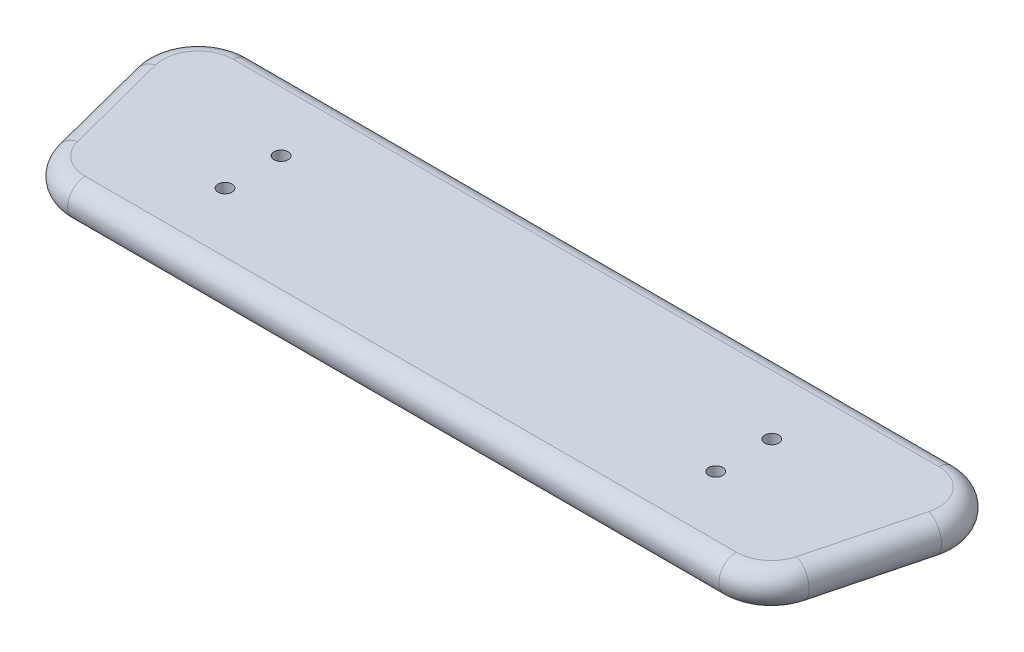
ISO-10303-21;
HEADER;
FILE_DESCRIPTION(('STEP AP214'),'2;1');
FILE_NAME('part.step','',(''),(''),'','','');
FILE_SCHEMA(('AUTOMOTIVE_DESIGN { 1 0 10303 214 1 1 1 1 }'));
ENDSEC;
DATA;
#1=APPLICATION_CONTEXT('core data for automotive mechanical design processes');
#2=APPLICATION_PROTOCOL_DEFINITION('international standard','automotive_design',2000,#1);
#3=PRODUCT_CONTEXT('',#1,'mechanical');
#4=PRODUCT('Part','Part','',(#3));
#5=PRODUCT_RELATED_PRODUCT_CATEGORY('part','',(#4));
#6=PRODUCT_DEFINITION_FORMATION('','',#4);
#7=PRODUCT_DEFINITION_CONTEXT('part definition',#1,'design');
#8=PRODUCT_DEFINITION('design','',#6,#7);
#9=PRODUCT_DEFINITION_SHAPE('','',#8);
#10=(LENGTH_UNIT() NAMED_UNIT(*) SI_UNIT(.MILLI.,.METRE.));
#11=(NAMED_UNIT(*) PLANE_ANGLE_UNIT() SI_UNIT($,.RADIAN.));
#12=(NAMED_UNIT(*) SI_UNIT($,.STERADIAN.) SOLID_ANGLE_UNIT());
#13=UNCERTAINTY_MEASURE_WITH_UNIT(LENGTH_MEASURE(1.E-05),#10,'distance_accuracy_value','');
#14=(GEOMETRIC_REPRESENTATION_CONTEXT(3) GLOBAL_UNCERTAINTY_ASSIGNED_CONTEXT((#13)) GLOBAL_UNIT_ASSIGNED_CONTEXT((#10,
#11,#12)) REPRESENTATION_CONTEXT('',''));
#15=CARTESIAN_POINT('',(0.,0.,0.));
#16=DIRECTION('',(0.,0.,1.));
#17=DIRECTION('',(1.,0.,0.));
#18=AXIS2_PLACEMENT_3D('',#15,#16,#17);
#19=CARTESIAN_POINT('',(-92.8687040210194,5.,25.));
#20=DIRECTION('',(1.,0.,0.));
#21=DIRECTION('',(0.,0.,-1.));
#22=AXIS2_PLACEMENT_3D('',#19,#20,#21);
#23=CYLINDRICAL_SURFACE('',#22,5.);
#24=CARTESIAN_POINT('',(92.8687040210193,5.,25.));
#25=DIRECTION('',(1.,0.,0.));
#26=DIRECTION('',(0.,0.,-1.));
#27=AXIS2_PLACEMENT_3D('',#24,#25,#26);
#28=CIRCLE('',#27,5.);
#29=CARTESIAN_POINT('',(92.8687040210193,10.,25.));
#30=VERTEX_POINT('',#29);
#31=CARTESIAN_POINT('',(92.8687040210193,0.,25.));
#32=VERTEX_POINT('',#31);
#33=EDGE_CURVE('E11',#30,#32,#28,.T.);
#34=ORIENTED_EDGE('',*,*,#33,.F.);
#35=DIRECTION('',(-1.,0.,0.));
#36=VECTOR('',#35,1.);
#37=CARTESIAN_POINT('',(-92.8687040210194,10.,25.));
#38=LINE('',#37,#36);
#39=CARTESIAN_POINT('',(-92.8687040210194,10.,25.));
#40=VERTEX_POINT('',#39);
#41=EDGE_CURVE('E115',#40,#30,#38,.F.);
#42=ORIENTED_EDGE('',*,*,#41,.F.);
#43=CARTESIAN_POINT('',(-92.8687040210194,5.,25.));
#44=DIRECTION('',(1.,0.,0.));
#45=DIRECTION('',(0.,0.,-1.));
#46=AXIS2_PLACEMENT_3D('',#43,#44,#45);
#47=CIRCLE('',#46,5.);
#48=CARTESIAN_POINT('',(-92.8687040210194,0.,25.));
#49=VERTEX_POINT('',#48);
#50=EDGE_CURVE('E43',#40,#49,#47,.T.);
#51=ORIENTED_EDGE('',*,*,#50,.T.);
#52=DIRECTION('',(1.,0.,0.));
#53=VECTOR('',#52,1.);
#54=CARTESIAN_POINT('',(-100.627231551696,0.,25.));
#55=LINE('',#54,#53);
#56=EDGE_CURVE('E142',#32,#49,#55,.F.);
#57=ORIENTED_EDGE('',*,*,#56,.F.);
#58=EDGE_LOOP('',(#34,#42,#51,#57));
#59=FACE_BOUND('',#58,.T.);
#60=ADVANCED_FACE('F35',(#59),#23,.T.);
#61=CARTESIAN_POINT('',(-92.8687040210195,5.,15.));
#62=DIRECTION('',(0.,1.,0.));
#63=DIRECTION('',(0.,0.,1.));
#64=AXIS2_PLACEMENT_3D('',#61,#62,#63);
#65=TOROIDAL_SURFACE('',#64,10.,5.);
#66=ORIENTED_EDGE('',*,*,#50,.F.);
#67=CARTESIAN_POINT('',(-92.8687040210195,10.,15.));
#68=DIRECTION('',(0.,1.,0.));
#69=DIRECTION('',(0.,0.,1.));
#70=AXIS2_PLACEMENT_3D('',#67,#68,#69);
#71=CIRCLE('',#70,10.);
#72=CARTESIAN_POINT('',(-102.550180424801,10.,17.5038000405444));
#73=VERTEX_POINT('',#72);
#74=EDGE_CURVE('E102',#73,#40,#71,.T.);
#75=ORIENTED_EDGE('',*,*,#74,.F.);
#76=CARTESIAN_POINT('',(-102.550180424801,5.,17.5038000405444));
#77=DIRECTION('',(0.250380004054439,0.,0.968147640378108));
#78=DIRECTION('',(0.968147640378108,0.,-0.250380004054439));
#79=AXIS2_PLACEMENT_3D('',#76,#77,#78);
#80=CIRCLE('',#79,5.);
#81=CARTESIAN_POINT('',(-102.550180424801,0.,17.5038000405444));
#82=VERTEX_POINT('',#81);
#83=EDGE_CURVE('E109',#73,#82,#80,.T.);
#84=ORIENTED_EDGE('',*,*,#83,.T.);
#85=CARTESIAN_POINT('',(-92.8687040210195,0.,15.));
#86=DIRECTION('',(0.,1.,0.));
#87=DIRECTION('',(0.,0.,1.));
#88=AXIS2_PLACEMENT_3D('',#85,#86,#87);
#89=CIRCLE('',#88,10.);
#90=EDGE_CURVE('E104',#49,#82,#89,.F.);
#91=ORIENTED_EDGE('',*,*,#90,.F.);
#92=EDGE_LOOP('',(#66,#75,#84,#91));
#93=FACE_BOUND('',#92,.T.);
#94=ADVANCED_FACE('F101',(#93),#65,.T.);
#95=CARTESIAN_POINT('',(-110.308707955477,5.,-12.4961999594555));
#96=DIRECTION('',(0.250380004054446,0.,0.968147640378107));
#97=DIRECTION('',(0.968147640378107,0.,-0.250380004054446));
#98=AXIS2_PLACEMENT_3D('',#95,#96,#97);
#99=CYLINDRICAL_SURFACE('',#98,5.);
#100=ORIENTED_EDGE('',*,*,#83,.F.);
#101=DIRECTION('',(-0.250380004054446,0.,-0.968147640378107));
#102=VECTOR('',#101,1.);
#103=CARTESIAN_POINT('',(-110.308707955477,10.,-12.4961999594555));
#104=LINE('',#103,#102);
#105=CARTESIAN_POINT('',(-110.308707955477,10.,-12.4961999594555));
#106=VERTEX_POINT('',#105);
#107=EDGE_CURVE('E118',#106,#73,#104,.F.);
#108=ORIENTED_EDGE('',*,*,#107,.F.);
#109=CARTESIAN_POINT('',(-110.308707955477,5.,-12.4961999594555));
#110=DIRECTION('',(0.250380004054454,0.,0.968147640378105));
#111=DIRECTION('',(0.968147640378105,0.,-0.250380004054454));
#112=AXIS2_PLACEMENT_3D('',#109,#110,#111);
#113=CIRCLE('',#112,5.);
#114=CARTESIAN_POINT('',(-110.308707955477,0.,-12.4961999594555));
#115=VERTEX_POINT('',#114);
#116=EDGE_CURVE('E169',#106,#115,#113,.T.);
#117=ORIENTED_EDGE('',*,*,#116,.T.);
#118=DIRECTION('',(0.250380004054446,0.,0.968147640378107));
#119=VECTOR('',#118,1.);
#120=CARTESIAN_POINT('',(-110.308707955477,0.,-12.4961999594555));
#121=LINE('',#120,#119);
#122=EDGE_CURVE('E145',#82,#115,#121,.F.);
#123=ORIENTED_EDGE('',*,*,#122,.F.);
#124=EDGE_LOOP('',(#100,#108,#117,#123));
#125=FACE_BOUND('',#124,.T.);
#126=ADVANCED_FACE('F173',(#125),#99,.T.);
#127=CARTESIAN_POINT('',(-100.627231551696,5.,-15.));
#128=DIRECTION('',(0.,1.,0.));
#129=DIRECTION('',(0.,0.,1.));
#130=AXIS2_PLACEMENT_3D('',#127,#128,#129);
#131=TOROIDAL_SURFACE('',#130,10.,5.);
#132=ORIENTED_EDGE('',*,*,#116,.F.);
#133=CARTESIAN_POINT('',(-100.627231551696,10.,-15.));
#134=DIRECTION('',(0.,1.,0.));
#135=DIRECTION('',(0.,0.,1.));
#136=AXIS2_PLACEMENT_3D('',#133,#134,#135);
#137=CIRCLE('',#136,10.);
#138=CARTESIAN_POINT('',(-100.627231551696,10.,-25.));
#139=VERTEX_POINT('',#138);
#140=EDGE_CURVE('E129',#139,#106,#137,.T.);
#141=ORIENTED_EDGE('',*,*,#140,.F.);
#142=CARTESIAN_POINT('',(-100.627231551696,5.,-25.));
#143=DIRECTION('',(-1.,0.,0.));
#144=DIRECTION('',(0.,0.,1.));
#145=AXIS2_PLACEMENT_3D('',#142,#143,#144);
#146=CIRCLE('',#145,5.);
#147=CARTESIAN_POINT('',(-100.627231551696,0.,-25.));
#148=VERTEX_POINT('',#147);
#149=EDGE_CURVE('E167',#139,#148,#146,.T.);
#150=ORIENTED_EDGE('',*,*,#149,.T.);
#151=CARTESIAN_POINT('',(-100.627231551696,0.,-15.));
#152=DIRECTION('',(0.,1.,0.));
#153=DIRECTION('',(0.,0.,1.));
#154=AXIS2_PLACEMENT_3D('',#151,#152,#153);
#155=CIRCLE('',#154,10.);
#156=EDGE_CURVE('E148',#115,#148,#155,.F.);
#157=ORIENTED_EDGE('',*,*,#156,.F.);
#158=EDGE_LOOP('',(#132,#141,#150,#157));
#159=FACE_BOUND('',#158,.T.);
#160=ADVANCED_FACE('F187',(#159),#131,.T.);
#161=CARTESIAN_POINT('',(100.627231551696,5.,-25.));
#162=DIRECTION('',(-1.,0.,0.));
#163=DIRECTION('',(0.,0.,1.));
#164=AXIS2_PLACEMENT_3D('',#161,#162,#163);
#165=CYLINDRICAL_SURFACE('',#164,5.);
#166=ORIENTED_EDGE('',*,*,#149,.F.);
#167=DIRECTION('',(-1.,0.,0.));
#168=VECTOR('',#167,1.);
#169=CARTESIAN_POINT('',(-100.627231551696,10.,-25.));
#170=LINE('',#169,#168);
#171=CARTESIAN_POINT('',(100.627231551696,10.,-25.));
#172=VERTEX_POINT('',#171);
#173=EDGE_CURVE('E131',#172,#139,#170,.T.);
#174=ORIENTED_EDGE('',*,*,#173,.F.);
#175=CARTESIAN_POINT('',(100.627231551696,5.,-25.));
#176=DIRECTION('',(-1.,0.,0.));
#177=DIRECTION('',(0.,0.,1.));
#178=AXIS2_PLACEMENT_3D('',#175,#176,#177);
#179=CIRCLE('',#178,5.);
#180=CARTESIAN_POINT('',(100.627231551696,0.,-25.));
#181=VERTEX_POINT('',#180);
#182=EDGE_CURVE('E165',#172,#181,#179,.T.);
#183=ORIENTED_EDGE('',*,*,#182,.T.);
#184=DIRECTION('',(1.,0.,0.));
#185=VECTOR('',#184,1.);
#186=CARTESIAN_POINT('',(100.627231551696,0.,-25.));
#187=LINE('',#186,#185);
#188=EDGE_CURVE('E151',#148,#181,#187,.T.);
#189=ORIENTED_EDGE('',*,*,#188,.F.);
#190=EDGE_LOOP('',(#166,#174,#183,#189));
#191=FACE_BOUND('',#190,.T.);
#192=ADVANCED_FACE('F185',(#191),#165,.T.);
#193=CARTESIAN_POINT('',(100.627231551696,5.,-15.));
#194=DIRECTION('',(0.,1.,0.));
#195=DIRECTION('',(0.,0.,1.));
#196=AXIS2_PLACEMENT_3D('',#193,#194,#195);
#197=TOROIDAL_SURFACE('',#196,10.,5.);
#198=ORIENTED_EDGE('',*,*,#182,.F.);
#199=CARTESIAN_POINT('',(100.627231551696,10.,-15.));
#200=DIRECTION('',(0.,1.,0.));
#201=DIRECTION('',(0.,0.,1.));
#202=AXIS2_PLACEMENT_3D('',#199,#200,#201);
#203=CIRCLE('',#202,10.);
#204=CARTESIAN_POINT('',(110.308707955477,10.,-12.4961999594554));
#205=VERTEX_POINT('',#204);
#206=EDGE_CURVE('E134',#205,#172,#203,.T.);
#207=ORIENTED_EDGE('',*,*,#206,.F.);
#208=CARTESIAN_POINT('',(110.308707955477,5.,-12.4961999594554));
#209=DIRECTION('',(0.250380004054446,0.,-0.968147640378107));
#210=DIRECTION('',(-0.968147640378107,0.,-0.250380004054446));
#211=AXIS2_PLACEMENT_3D('',#208,#209,#210);
#212=CIRCLE('',#211,5.);
#213=CARTESIAN_POINT('',(110.308707955477,0.,-12.4961999594554));
#214=VERTEX_POINT('',#213);
#215=EDGE_CURVE('E58',#205,#214,#212,.T.);
#216=ORIENTED_EDGE('',*,*,#215,.T.);
#217=CARTESIAN_POINT('',(100.627231551696,0.,-15.));
#218=DIRECTION('',(0.,1.,0.));
#219=DIRECTION('',(0.,0.,1.));
#220=AXIS2_PLACEMENT_3D('',#217,#218,#219);
#221=CIRCLE('',#220,10.);
#222=EDGE_CURVE('E154',#181,#214,#221,.F.);
#223=ORIENTED_EDGE('',*,*,#222,.F.);
#224=EDGE_LOOP('',(#198,#207,#216,#223));
#225=FACE_BOUND('',#224,.T.);
#226=ADVANCED_FACE('F181',(#225),#197,.T.);
#227=CARTESIAN_POINT('',(102.5501804248,5.,17.5038000405444));
#228=DIRECTION('',(0.250380004054446,0.,-0.968147640378107));
#229=DIRECTION('',(-0.968147640378107,0.,-0.250380004054446));
#230=AXIS2_PLACEMENT_3D('',#227,#228,#229);
#231=CYLINDRICAL_SURFACE('',#230,5.);
#232=ORIENTED_EDGE('',*,*,#215,.F.);
#233=DIRECTION('',(0.250380004054446,0.,-0.968147640378107));
#234=VECTOR('',#233,1.);
#235=CARTESIAN_POINT('',(97.6920361937733,10.,36.2888499555633));
#236=LINE('',#235,#234);
#237=CARTESIAN_POINT('',(102.5501804248,10.,17.5038000405444));
#238=VERTEX_POINT('',#237);
#239=EDGE_CURVE('E137',#238,#205,#236,.T.);
#240=ORIENTED_EDGE('',*,*,#239,.F.);
#241=CARTESIAN_POINT('',(102.5501804248,5.,17.5038000405444));
#242=DIRECTION('',(0.25038000405444,0.,-0.968147640378108));
#243=DIRECTION('',(-0.968147640378108,0.,-0.25038000405444));
#244=AXIS2_PLACEMENT_3D('',#241,#242,#243);
#245=CIRCLE('',#244,5.);
#246=CARTESIAN_POINT('',(102.5501804248,0.,17.5038000405444));
#247=VERTEX_POINT('',#246);
#248=EDGE_CURVE('E50',#238,#247,#245,.T.);
#249=ORIENTED_EDGE('',*,*,#248,.T.);
#250=DIRECTION('',(-0.250380004054446,0.,0.968147640378107));
#251=VECTOR('',#250,1.);
#252=CARTESIAN_POINT('',(102.5501804248,0.,17.5038000405444));
#253=LINE('',#252,#251);
#254=EDGE_CURVE('E157',#214,#247,#253,.T.);
#255=ORIENTED_EDGE('',*,*,#254,.F.);
#256=EDGE_LOOP('',(#232,#240,#249,#255));
#257=FACE_BOUND('',#256,.T.);
#258=ADVANCED_FACE('F179',(#257),#231,.T.);
#259=CARTESIAN_POINT('',(92.8687040210194,5.,15.));
#260=DIRECTION('',(0.,1.,0.));
#261=DIRECTION('',(0.,0.,1.));
#262=AXIS2_PLACEMENT_3D('',#259,#260,#261);
#263=TOROIDAL_SURFACE('',#262,10.,5.);
#264=CARTESIAN_POINT('',(92.8687040210194,10.,15.));
#265=DIRECTION('',(0.,1.,0.));
#266=DIRECTION('',(0.,0.,1.));
#267=AXIS2_PLACEMENT_3D('',#264,#265,#266);
#268=CIRCLE('',#267,10.);
#269=EDGE_CURVE('E140',#30,#238,#268,.T.);
#270=ORIENTED_EDGE('',*,*,#269,.F.);
#271=ORIENTED_EDGE('',*,*,#33,.T.);
#272=CARTESIAN_POINT('',(92.8687040210194,0.,15.));
#273=DIRECTION('',(0.,1.,0.));
#274=DIRECTION('',(0.,0.,1.));
#275=AXIS2_PLACEMENT_3D('',#272,#273,#274);
#276=CIRCLE('',#275,10.);
#277=EDGE_CURVE('E160',#247,#32,#276,.F.);
#278=ORIENTED_EDGE('',*,*,#277,.F.);
#279=ORIENTED_EDGE('',*,*,#248,.F.);
#280=EDGE_LOOP('',(#270,#271,#278,#279));
#281=FACE_BOUND('',#280,.T.);
#282=ADVANCED_FACE('F178',(#281),#263,.T.);
#283=CARTESIAN_POINT('',(-100.627231551696,10.,-15.));
#284=DIRECTION('',(0.,1.,0.));
#285=DIRECTION('',(0.,0.,1.));
#286=AXIS2_PLACEMENT_3D('',#283,#284,#285);
#287=PLANE('',#286);
#288=CARTESIAN_POINT('',(70.,10.,8.));
#289=DIRECTION('',(0.,-1.,0.));
#290=DIRECTION('',(0.,0.,1.));
#291=AXIS2_PLACEMENT_3D('',#288,#289,#290);
#292=CIRCLE('',#291,2.);
#293=CARTESIAN_POINT('',(70.,10.,10.));
#294=VERTEX_POINT('',#293);
#295=EDGE_CURVE('E281',#294,#294,#292,.T.);
#296=ORIENTED_EDGE('',*,*,#295,.T.);
#297=EDGE_LOOP('',(#296));
#298=FACE_BOUND('',#297,.T.);
#299=CARTESIAN_POINT('',(70.,10.,-8.));
#300=DIRECTION('',(0.,-1.,0.));
#301=DIRECTION('',(0.,0.,-1.));
#302=AXIS2_PLACEMENT_3D('',#299,#300,#301);
#303=CIRCLE('',#302,2.);
#304=CARTESIAN_POINT('',(70.,10.,-10.));
#305=VERTEX_POINT('',#304);
#306=EDGE_CURVE('E271',#305,#305,#303,.T.);
#307=ORIENTED_EDGE('',*,*,#306,.T.);
#308=EDGE_LOOP('',(#307));
#309=FACE_BOUND('',#308,.T.);
#310=CARTESIAN_POINT('',(-70.,10.,-8.));
#311=DIRECTION('',(0.,-1.,0.));
#312=DIRECTION('',(0.,0.,1.));
#313=AXIS2_PLACEMENT_3D('',#310,#311,#312);
#314=CIRCLE('',#313,2.);
#315=CARTESIAN_POINT('',(-70.,10.,-6.));
#316=VERTEX_POINT('',#315);
#317=EDGE_CURVE('E270',#316,#316,#314,.T.);
#318=ORIENTED_EDGE('',*,*,#317,.T.);
#319=EDGE_LOOP('',(#318));
#320=FACE_BOUND('',#319,.T.);
#321=CARTESIAN_POINT('',(-70.,10.,8.));
#322=DIRECTION('',(0.,-1.,0.));
#323=DIRECTION('',(0.,0.,-1.));
#324=AXIS2_PLACEMENT_3D('',#321,#322,#323);
#325=CIRCLE('',#324,2.);
#326=CARTESIAN_POINT('',(-70.,10.,6.));
#327=VERTEX_POINT('',#326);
#328=EDGE_CURVE('E121',#327,#327,#325,.T.);
#329=ORIENTED_EDGE('',*,*,#328,.T.);
#330=EDGE_LOOP('',(#329));
#331=FACE_BOUND('',#330,.T.);
#332=ORIENTED_EDGE('',*,*,#41,.T.);
#333=ORIENTED_EDGE('',*,*,#269,.T.);
#334=ORIENTED_EDGE('',*,*,#239,.T.);
#335=ORIENTED_EDGE('',*,*,#206,.T.);
#336=ORIENTED_EDGE('',*,*,#173,.T.);
#337=ORIENTED_EDGE('',*,*,#140,.T.);
#338=ORIENTED_EDGE('',*,*,#107,.T.);
#339=ORIENTED_EDGE('',*,*,#74,.T.);
#340=EDGE_LOOP('',(#332,#333,#334,#335,#336,#337,#338,#339));
#341=FACE_BOUND('',#340,.T.);
#342=ADVANCED_FACE('F113',(#298,#309,#320,#331,#341),#287,.T.);
#343=CARTESIAN_POINT('',(-100.627231551696,0.,-15.));
#344=DIRECTION('',(0.,1.,0.));
#345=DIRECTION('',(0.,0.,1.));
#346=AXIS2_PLACEMENT_3D('',#343,#344,#345);
#347=PLANE('',#346);
#348=ORIENTED_EDGE('',*,*,#254,.T.);
#349=ORIENTED_EDGE('',*,*,#277,.T.);
#350=ORIENTED_EDGE('',*,*,#56,.T.);
#351=ORIENTED_EDGE('',*,*,#90,.T.);
#352=ORIENTED_EDGE('',*,*,#122,.T.);
#353=ORIENTED_EDGE('',*,*,#156,.T.);
#354=ORIENTED_EDGE('',*,*,#188,.T.);
#355=ORIENTED_EDGE('',*,*,#222,.T.);
#356=EDGE_LOOP('',(#348,#349,#350,#351,#352,#353,#354,#355));
#357=FACE_BOUND('',#356,.T.);
#358=ADVANCED_FACE('F176',(#357),#347,.F.);
#359=CARTESIAN_POINT('',(-70.,10.,8.));
#360=DIRECTION('',(0.,-1.,0.));
#361=DIRECTION('',(0.,0.,-1.));
#362=AXIS2_PLACEMENT_3D('',#359,#360,#361);
#363=CYLINDRICAL_SURFACE('',#362,2.);
#364=ORIENTED_EDGE('',*,*,#328,.F.);
#365=EDGE_LOOP('',(#364));
#366=FACE_BOUND('',#365,.T.);
#367=CARTESIAN_POINT('',(-70.,2.,8.));
#368=DIRECTION('',(0.,-1.,0.));
#369=DIRECTION('',(0.,0.,-1.));
#370=AXIS2_PLACEMENT_3D('',#367,#368,#369);
#371=CIRCLE('',#370,2.);
#372=CARTESIAN_POINT('',(-70.,2.,6.));
#373=VERTEX_POINT('',#372);
#374=EDGE_CURVE('E124',#373,#373,#371,.T.);
#375=ORIENTED_EDGE('',*,*,#374,.T.);
#376=EDGE_LOOP('',(#375));
#377=FACE_BOUND('',#376,.T.);
#378=ADVANCED_FACE('F230',(#366,#377),#363,.F.);
#379=CARTESIAN_POINT('',(-70.,2.,8.));
#380=DIRECTION('',(0.,-1.,0.));
#381=DIRECTION('',(0.,0.,-1.));
#382=AXIS2_PLACEMENT_3D('',#379,#380,#381);
#383=PLANE('',#382);
#384=ORIENTED_EDGE('',*,*,#374,.F.);
#385=EDGE_LOOP('',(#384));
#386=FACE_BOUND('',#385,.T.);
#387=ADVANCED_FACE('F236',(#386),#383,.F.);
#388=CARTESIAN_POINT('',(-70.,10.,-8.));
#389=DIRECTION('',(0.,-1.,0.));
#390=DIRECTION('',(0.,0.,-1.));
#391=AXIS2_PLACEMENT_3D('',#388,#389,#390);
#392=CYLINDRICAL_SURFACE('',#391,2.);
#393=ORIENTED_EDGE('',*,*,#317,.F.);
#394=EDGE_LOOP('',(#393));
#395=FACE_BOUND('',#394,.T.);
#396=CARTESIAN_POINT('',(-70.,2.,-8.));
#397=DIRECTION('',(0.,-1.,0.));
#398=DIRECTION('',(0.,0.,1.));
#399=AXIS2_PLACEMENT_3D('',#396,#397,#398);
#400=CIRCLE('',#399,2.);
#401=CARTESIAN_POINT('',(-70.,2.,-6.));
#402=VERTEX_POINT('',#401);
#403=EDGE_CURVE('E268',#402,#402,#400,.T.);
#404=ORIENTED_EDGE('',*,*,#403,.T.);
#405=EDGE_LOOP('',(#404));
#406=FACE_BOUND('',#405,.T.);
#407=ADVANCED_FACE('F240',(#395,#406),#392,.F.);
#408=CARTESIAN_POINT('',(-70.,2.,-8.));
#409=DIRECTION('',(0.,1.,0.));
#410=DIRECTION('',(0.,0.,1.));
#411=AXIS2_PLACEMENT_3D('',#408,#409,#410);
#412=PLANE('',#411);
#413=ORIENTED_EDGE('',*,*,#403,.F.);
#414=EDGE_LOOP('',(#413));
#415=FACE_BOUND('',#414,.T.);
#416=ADVANCED_FACE('F254',(#415),#412,.T.);
#417=CARTESIAN_POINT('',(70.,10.,-8.));
#418=DIRECTION('',(0.,-1.,0.));
#419=DIRECTION('',(0.,0.,-1.));
#420=AXIS2_PLACEMENT_3D('',#417,#418,#419);
#421=CYLINDRICAL_SURFACE('',#420,2.);
#422=ORIENTED_EDGE('',*,*,#306,.F.);
#423=EDGE_LOOP('',(#422));
#424=FACE_BOUND('',#423,.T.);
#425=CARTESIAN_POINT('',(70.,2.,-8.));
#426=DIRECTION('',(0.,-1.,0.));
#427=DIRECTION('',(0.,0.,-1.));
#428=AXIS2_PLACEMENT_3D('',#425,#426,#427);
#429=CIRCLE('',#428,2.);
#430=CARTESIAN_POINT('',(70.,2.,-10.));
#431=VERTEX_POINT('',#430);
#432=EDGE_CURVE('E276',#431,#431,#429,.T.);
#433=ORIENTED_EDGE('',*,*,#432,.T.);
#434=EDGE_LOOP('',(#433));
#435=FACE_BOUND('',#434,.T.);
#436=ADVANCED_FACE('F251',(#424,#435),#421,.F.);
#437=CARTESIAN_POINT('',(70.,2.,-8.));
#438=DIRECTION('',(0.,-1.,0.));
#439=DIRECTION('',(0.,0.,-1.));
#440=AXIS2_PLACEMENT_3D('',#437,#438,#439);
#441=PLANE('',#440);
#442=ORIENTED_EDGE('',*,*,#432,.F.);
#443=EDGE_LOOP('',(#442));
#444=FACE_BOUND('',#443,.T.);
#445=ADVANCED_FACE('F246',(#444),#441,.F.);
#446=CARTESIAN_POINT('',(70.,10.,8.));
#447=DIRECTION('',(0.,-1.,0.));
#448=DIRECTION('',(0.,0.,-1.));
#449=AXIS2_PLACEMENT_3D('',#446,#447,#448);
#450=CYLINDRICAL_SURFACE('',#449,2.);
#451=ORIENTED_EDGE('',*,*,#295,.F.);
#452=EDGE_LOOP('',(#451));
#453=FACE_BOUND('',#452,.T.);
#454=CARTESIAN_POINT('',(70.,2.,8.));
#455=DIRECTION('',(0.,-1.,0.));
#456=DIRECTION('',(0.,0.,1.));
#457=AXIS2_PLACEMENT_3D('',#454,#455,#456);
#458=CIRCLE('',#457,2.);
#459=CARTESIAN_POINT('',(70.,2.,10.));
#460=VERTEX_POINT('',#459);
#461=EDGE_CURVE('E284',#460,#460,#458,.T.);
#462=ORIENTED_EDGE('',*,*,#461,.T.);
#463=EDGE_LOOP('',(#462));
#464=FACE_BOUND('',#463,.T.);
#465=ADVANCED_FACE('F242',(#453,#464),#450,.F.);
#466=CARTESIAN_POINT('',(70.,2.,8.));
#467=DIRECTION('',(0.,1.,0.));
#468=DIRECTION('',(0.,0.,1.));
#469=AXIS2_PLACEMENT_3D('',#466,#467,#468);
#470=PLANE('',#469);
#471=ORIENTED_EDGE('',*,*,#461,.F.);
#472=EDGE_LOOP('',(#471));
#473=FACE_BOUND('',#472,.T.);
#474=ADVANCED_FACE('F245',(#473),#470,.T.);
#475=CLOSED_SHELL('',(#60,#94,#126,#160,#192,#226,#258,#282,#342,#358,#378,#387,#407,#416,#436,
#445,#465,#474));
#476=MANIFOLD_SOLID_BREP('B2',#475);
#477=ADVANCED_BREP_SHAPE_REPRESENTATION('',(#18,#476),#14);
#478=SHAPE_DEFINITION_REPRESENTATION(#9,#477);
ENDSEC;
END-ISO-10303-21;
